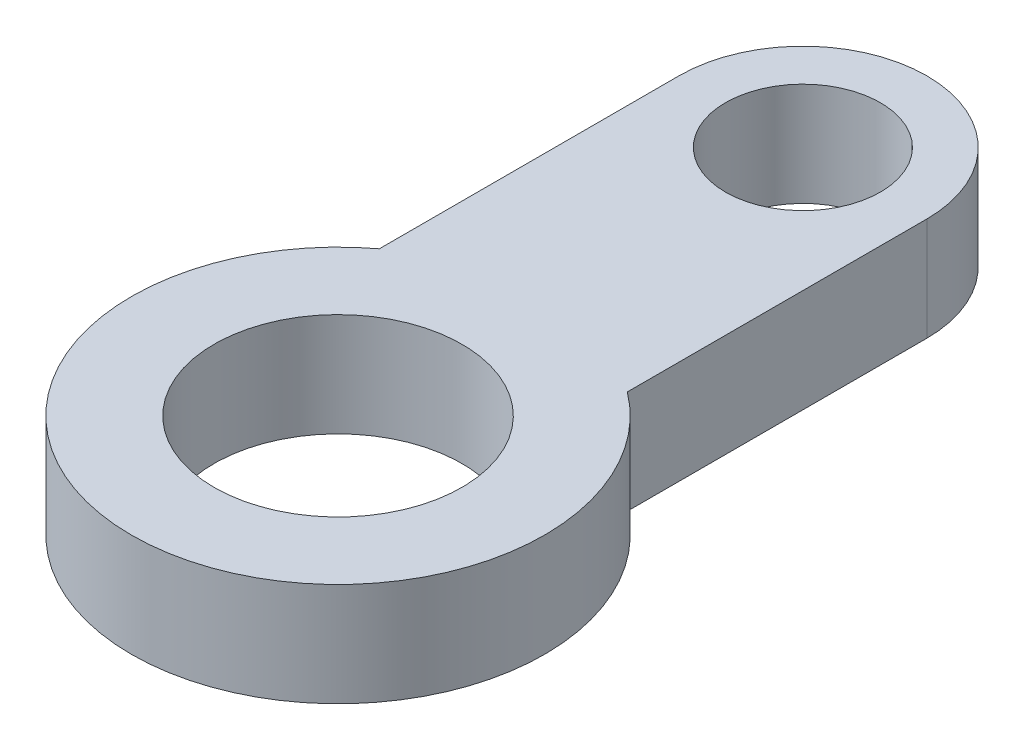
ISO-10303-21;
HEADER;
FILE_DESCRIPTION(('STEP AP214'),'2;1');
FILE_NAME('part.step','',(''),(''),'','','');
FILE_SCHEMA(('AUTOMOTIVE_DESIGN { 1 0 10303 214 1 1 1 1 }'));
ENDSEC;
DATA;
#1=APPLICATION_CONTEXT('core data for automotive mechanical design processes');
#2=APPLICATION_PROTOCOL_DEFINITION('international standard','automotive_design',2000,#1);
#3=PRODUCT_CONTEXT('',#1,'mechanical');
#4=PRODUCT('Part','Part','',(#3));
#5=PRODUCT_RELATED_PRODUCT_CATEGORY('part','',(#4));
#6=PRODUCT_DEFINITION_FORMATION('','',#4);
#7=PRODUCT_DEFINITION_CONTEXT('part definition',#1,'design');
#8=PRODUCT_DEFINITION('design','',#6,#7);
#9=PRODUCT_DEFINITION_SHAPE('','',#8);
#10=(LENGTH_UNIT() NAMED_UNIT(*) SI_UNIT(.MILLI.,.METRE.));
#11=(NAMED_UNIT(*) PLANE_ANGLE_UNIT() SI_UNIT($,.RADIAN.));
#12=(NAMED_UNIT(*) SI_UNIT($,.STERADIAN.) SOLID_ANGLE_UNIT());
#13=UNCERTAINTY_MEASURE_WITH_UNIT(LENGTH_MEASURE(1.E-05),#10,'distance_accuracy_value','');
#14=(GEOMETRIC_REPRESENTATION_CONTEXT(3) GLOBAL_UNCERTAINTY_ASSIGNED_CONTEXT((#13)) GLOBAL_UNIT_ASSIGNED_CONTEXT((#10,
#11,#12)) REPRESENTATION_CONTEXT('',''));
#15=CARTESIAN_POINT('',(0.,0.,0.));
#16=DIRECTION('',(0.,0.,1.));
#17=DIRECTION('',(1.,0.,0.));
#18=AXIS2_PLACEMENT_3D('',#15,#16,#17);
#19=CARTESIAN_POINT('',(0.,10.,0.));
#20=DIRECTION('',(0.,1.,0.));
#21=DIRECTION('',(0.,0.,1.));
#22=AXIS2_PLACEMENT_3D('',#19,#20,#21);
#23=PLANE('',#22);
#24=CARTESIAN_POINT('',(0.,10.,0.));
#25=DIRECTION('',(0.,1.,0.));
#26=DIRECTION('',(0.,0.,1.));
#27=AXIS2_PLACEMENT_3D('',#24,#25,#26);
#28=CIRCLE('',#27,12.);
#29=CARTESIAN_POINT('',(0.,10.,12.));
#30=VERTEX_POINT('',#29);
#31=EDGE_CURVE('E118',#30,#30,#28,.T.);
#32=ORIENTED_EDGE('',*,*,#31,.F.);
#33=EDGE_LOOP('',(#32));
#34=FACE_BOUND('',#33,.T.);
#35=CARTESIAN_POINT('',(0.,10.,0.));
#36=DIRECTION('',(0.,1.,0.));
#37=DIRECTION('',(0.,0.,1.));
#38=AXIS2_PLACEMENT_3D('',#35,#36,#37);
#39=CIRCLE('',#38,20.);
#40=CARTESIAN_POINT('',(-12.,10.,-16.));
#41=VERTEX_POINT('',#40);
#42=CARTESIAN_POINT('',(12.,10.,-16.));
#43=VERTEX_POINT('',#42);
#44=EDGE_CURVE('E98',#41,#43,#39,.T.);
#45=ORIENTED_EDGE('',*,*,#44,.T.);
#46=DIRECTION('',(0.,0.,-1.));
#47=VECTOR('',#46,1.);
#48=CARTESIAN_POINT('',(12.,10.,-16.));
#49=LINE('',#48,#47);
#50=CARTESIAN_POINT('',(12.,10.,-45.));
#51=VERTEX_POINT('',#50);
#52=EDGE_CURVE('E93',#43,#51,#49,.T.);
#53=ORIENTED_EDGE('',*,*,#52,.T.);
#54=CARTESIAN_POINT('',(0.,10.,-45.));
#55=DIRECTION('',(0.,1.,0.));
#56=DIRECTION('',(0.,0.,-1.));
#57=AXIS2_PLACEMENT_3D('',#54,#55,#56);
#58=CIRCLE('',#57,12.);
#59=CARTESIAN_POINT('',(-12.,10.,-45.));
#60=VERTEX_POINT('',#59);
#61=EDGE_CURVE('E96',#51,#60,#58,.T.);
#62=ORIENTED_EDGE('',*,*,#61,.T.);
#63=DIRECTION('',(0.,0.,1.));
#64=VECTOR('',#63,1.);
#65=CARTESIAN_POINT('',(-12.,10.,-16.));
#66=LINE('',#65,#64);
#67=EDGE_CURVE('E63',#60,#41,#66,.T.);
#68=ORIENTED_EDGE('',*,*,#67,.T.);
#69=EDGE_LOOP('',(#45,#53,#62,#68));
#70=FACE_BOUND('',#69,.T.);
#71=CARTESIAN_POINT('',(0.,10.,-45.));
#72=DIRECTION('',(0.,1.,0.));
#73=DIRECTION('',(0.,0.,1.));
#74=AXIS2_PLACEMENT_3D('',#71,#72,#73);
#75=CIRCLE('',#74,7.5);
#76=CARTESIAN_POINT('',(0.,10.,-37.5));
#77=VERTEX_POINT('',#76);
#78=EDGE_CURVE('E140',#77,#77,#75,.T.);
#79=ORIENTED_EDGE('',*,*,#78,.F.);
#80=EDGE_LOOP('',(#79));
#81=FACE_BOUND('',#80,.T.);
#82=ADVANCED_FACE('F45',(#34,#70,#81),#23,.T.);
#83=CARTESIAN_POINT('',(0.,0.,0.));
#84=DIRECTION('',(0.,1.,0.));
#85=DIRECTION('',(0.,0.,1.));
#86=AXIS2_PLACEMENT_3D('',#83,#84,#85);
#87=PLANE('',#86);
#88=CARTESIAN_POINT('',(0.,0.,0.));
#89=DIRECTION('',(0.,1.,0.));
#90=DIRECTION('',(0.,0.,1.));
#91=AXIS2_PLACEMENT_3D('',#88,#89,#90);
#92=CIRCLE('',#91,20.);
#93=CARTESIAN_POINT('',(-12.,0.,-16.));
#94=VERTEX_POINT('',#93);
#95=CARTESIAN_POINT('',(12.,0.,-16.));
#96=VERTEX_POINT('',#95);
#97=EDGE_CURVE('E114',#94,#96,#92,.T.);
#98=ORIENTED_EDGE('',*,*,#97,.F.);
#99=DIRECTION('',(0.,0.,1.));
#100=VECTOR('',#99,1.);
#101=CARTESIAN_POINT('',(-12.,0.,-16.));
#102=LINE('',#101,#100);
#103=CARTESIAN_POINT('',(-12.,0.,-45.));
#104=VERTEX_POINT('',#103);
#105=EDGE_CURVE('E86',#104,#94,#102,.T.);
#106=ORIENTED_EDGE('',*,*,#105,.F.);
#107=CARTESIAN_POINT('',(0.,0.,-45.));
#108=DIRECTION('',(0.,1.,0.));
#109=DIRECTION('',(0.,0.,-1.));
#110=AXIS2_PLACEMENT_3D('',#107,#108,#109);
#111=CIRCLE('',#110,12.);
#112=CARTESIAN_POINT('',(12.,0.,-45.));
#113=VERTEX_POINT('',#112);
#114=EDGE_CURVE('E80',#113,#104,#111,.T.);
#115=ORIENTED_EDGE('',*,*,#114,.F.);
#116=DIRECTION('',(0.,0.,-1.));
#117=VECTOR('',#116,1.);
#118=CARTESIAN_POINT('',(12.,0.,-16.));
#119=LINE('',#118,#117);
#120=EDGE_CURVE('E103',#96,#113,#119,.T.);
#121=ORIENTED_EDGE('',*,*,#120,.F.);
#122=EDGE_LOOP('',(#98,#106,#115,#121));
#123=FACE_BOUND('',#122,.T.);
#124=CARTESIAN_POINT('',(0.,0.,0.));
#125=DIRECTION('',(0.,1.,0.));
#126=DIRECTION('',(0.,0.,1.));
#127=AXIS2_PLACEMENT_3D('',#124,#125,#126);
#128=CIRCLE('',#127,12.);
#129=CARTESIAN_POINT('',(0.,0.,12.));
#130=VERTEX_POINT('',#129);
#131=EDGE_CURVE('E136',#130,#130,#128,.T.);
#132=ORIENTED_EDGE('',*,*,#131,.T.);
#133=EDGE_LOOP('',(#132));
#134=FACE_BOUND('',#133,.T.);
#135=CARTESIAN_POINT('',(0.,0.,-45.));
#136=DIRECTION('',(0.,1.,0.));
#137=DIRECTION('',(0.,0.,1.));
#138=AXIS2_PLACEMENT_3D('',#135,#136,#137);
#139=CIRCLE('',#138,7.5);
#140=CARTESIAN_POINT('',(0.,0.,-37.5));
#141=VERTEX_POINT('',#140);
#142=EDGE_CURVE('E144',#141,#141,#139,.T.);
#143=ORIENTED_EDGE('',*,*,#142,.T.);
#144=EDGE_LOOP('',(#143));
#145=FACE_BOUND('',#144,.T.);
#146=ADVANCED_FACE('F131',(#123,#134,#145),#87,.F.);
#147=CARTESIAN_POINT('',(0.,10.,0.));
#148=DIRECTION('',(0.,-1.,0.));
#149=DIRECTION('',(0.,0.,-1.));
#150=AXIS2_PLACEMENT_3D('',#147,#148,#149);
#151=CYLINDRICAL_SURFACE('',#150,20.);
#152=ORIENTED_EDGE('',*,*,#97,.T.);
#153=DIRECTION('',(0.,-1.,0.));
#154=VECTOR('',#153,1.);
#155=CARTESIAN_POINT('',(12.,10.,-16.));
#156=LINE('',#155,#154);
#157=EDGE_CURVE('E11',#43,#96,#156,.T.);
#158=ORIENTED_EDGE('',*,*,#157,.F.);
#159=ORIENTED_EDGE('',*,*,#44,.F.);
#160=DIRECTION('',(0.,-1.,0.));
#161=VECTOR('',#160,1.);
#162=CARTESIAN_POINT('',(-12.,10.,-16.));
#163=LINE('',#162,#161);
#164=EDGE_CURVE('E110',#41,#94,#163,.T.);
#165=ORIENTED_EDGE('',*,*,#164,.T.);
#166=EDGE_LOOP('',(#152,#158,#159,#165));
#167=FACE_BOUND('',#166,.T.);
#168=ADVANCED_FACE('F47',(#167),#151,.T.);
#169=CARTESIAN_POINT('',(12.,10.,-16.));
#170=DIRECTION('',(-1.,0.,0.));
#171=DIRECTION('',(0.,0.,1.));
#172=AXIS2_PLACEMENT_3D('',#169,#170,#171);
#173=PLANE('',#172);
#174=ORIENTED_EDGE('',*,*,#120,.T.);
#175=DIRECTION('',(0.,-1.,0.));
#176=VECTOR('',#175,1.);
#177=CARTESIAN_POINT('',(12.,10.,-45.));
#178=LINE('',#177,#176);
#179=EDGE_CURVE('E55',#51,#113,#178,.T.);
#180=ORIENTED_EDGE('',*,*,#179,.F.);
#181=ORIENTED_EDGE('',*,*,#52,.F.);
#182=ORIENTED_EDGE('',*,*,#157,.T.);
#183=EDGE_LOOP('',(#174,#180,#181,#182));
#184=FACE_BOUND('',#183,.T.);
#185=ADVANCED_FACE('F102',(#184),#173,.F.);
#186=CARTESIAN_POINT('',(0.,10.,-45.));
#187=DIRECTION('',(0.,-1.,0.));
#188=DIRECTION('',(0.,0.,-1.));
#189=AXIS2_PLACEMENT_3D('',#186,#187,#188);
#190=CYLINDRICAL_SURFACE('',#189,12.);
#191=ORIENTED_EDGE('',*,*,#114,.T.);
#192=DIRECTION('',(0.,-1.,0.));
#193=VECTOR('',#192,1.);
#194=CARTESIAN_POINT('',(-12.,10.,-45.));
#195=LINE('',#194,#193);
#196=EDGE_CURVE('E105',#60,#104,#195,.T.);
#197=ORIENTED_EDGE('',*,*,#196,.F.);
#198=ORIENTED_EDGE('',*,*,#61,.F.);
#199=ORIENTED_EDGE('',*,*,#179,.T.);
#200=EDGE_LOOP('',(#191,#197,#198,#199));
#201=FACE_BOUND('',#200,.T.);
#202=ADVANCED_FACE('F106',(#201),#190,.T.);
#203=CARTESIAN_POINT('',(-12.,10.,-16.));
#204=DIRECTION('',(1.,0.,0.));
#205=DIRECTION('',(0.,0.,-1.));
#206=AXIS2_PLACEMENT_3D('',#203,#204,#205);
#207=PLANE('',#206);
#208=ORIENTED_EDGE('',*,*,#105,.T.);
#209=ORIENTED_EDGE('',*,*,#164,.F.);
#210=ORIENTED_EDGE('',*,*,#67,.F.);
#211=ORIENTED_EDGE('',*,*,#196,.T.);
#212=EDGE_LOOP('',(#208,#209,#210,#211));
#213=FACE_BOUND('',#212,.T.);
#214=ADVANCED_FACE('F128',(#213),#207,.F.);
#215=CARTESIAN_POINT('',(0.,10.,0.));
#216=DIRECTION('',(0.,-1.,0.));
#217=DIRECTION('',(0.,0.,-1.));
#218=AXIS2_PLACEMENT_3D('',#215,#216,#217);
#219=CYLINDRICAL_SURFACE('',#218,12.);
#220=ORIENTED_EDGE('',*,*,#31,.T.);
#221=EDGE_LOOP('',(#220));
#222=FACE_BOUND('',#221,.T.);
#223=ORIENTED_EDGE('',*,*,#131,.F.);
#224=EDGE_LOOP('',(#223));
#225=FACE_BOUND('',#224,.T.);
#226=ADVANCED_FACE('F163',(#222,#225),#219,.F.);
#227=CARTESIAN_POINT('',(0.,10.,-45.));
#228=DIRECTION('',(0.,-1.,0.));
#229=DIRECTION('',(0.,0.,-1.));
#230=AXIS2_PLACEMENT_3D('',#227,#228,#229);
#231=CYLINDRICAL_SURFACE('',#230,7.5);
#232=ORIENTED_EDGE('',*,*,#78,.T.);
#233=EDGE_LOOP('',(#232));
#234=FACE_BOUND('',#233,.T.);
#235=ORIENTED_EDGE('',*,*,#142,.F.);
#236=EDGE_LOOP('',(#235));
#237=FACE_BOUND('',#236,.T.);
#238=ADVANCED_FACE('F152',(#234,#237),#231,.F.);
#239=CLOSED_SHELL('',(#82,#146,#168,#185,#202,#214,#226,#238));
#240=MANIFOLD_SOLID_BREP('B2',#239);
#241=ADVANCED_BREP_SHAPE_REPRESENTATION('',(#18,#240),#14);
#242=SHAPE_DEFINITION_REPRESENTATION(#9,#241);
ENDSEC;
END-ISO-10303-21;
